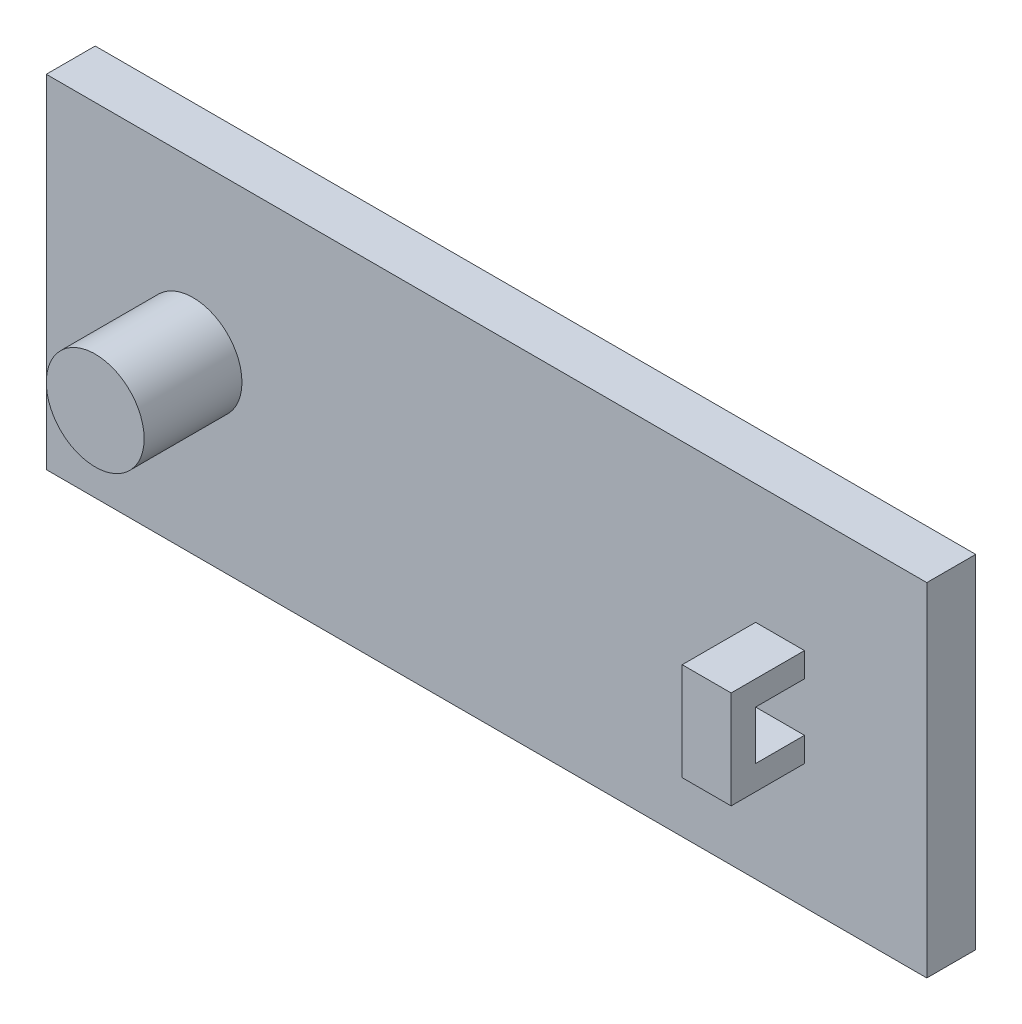
ISO-10303-21;
HEADER;
FILE_DESCRIPTION(('STEP AP214'),'2;1');
FILE_NAME('part.step','',(''),(''),'','','');
FILE_SCHEMA(('AUTOMOTIVE_DESIGN { 1 0 10303 214 1 1 1 1 }'));
ENDSEC;
DATA;
#1=APPLICATION_CONTEXT('core data for automotive mechanical design processes');
#2=APPLICATION_PROTOCOL_DEFINITION('international standard','automotive_design',2000,#1);
#3=PRODUCT_CONTEXT('',#1,'mechanical');
#4=PRODUCT('Part','Part','',(#3));
#5=PRODUCT_RELATED_PRODUCT_CATEGORY('part','',(#4));
#6=PRODUCT_DEFINITION_FORMATION('','',#4);
#7=PRODUCT_DEFINITION_CONTEXT('part definition',#1,'design');
#8=PRODUCT_DEFINITION('design','',#6,#7);
#9=PRODUCT_DEFINITION_SHAPE('','',#8);
#10=(LENGTH_UNIT() NAMED_UNIT(*) SI_UNIT(.MILLI.,.METRE.));
#11=(NAMED_UNIT(*) PLANE_ANGLE_UNIT() SI_UNIT($,.RADIAN.));
#12=(NAMED_UNIT(*) SI_UNIT($,.STERADIAN.) SOLID_ANGLE_UNIT());
#13=UNCERTAINTY_MEASURE_WITH_UNIT(LENGTH_MEASURE(1.E-05),#10,'distance_accuracy_value','');
#14=(GEOMETRIC_REPRESENTATION_CONTEXT(3) GLOBAL_UNCERTAINTY_ASSIGNED_CONTEXT((#13)) GLOBAL_UNIT_ASSIGNED_CONTEXT((#10,
#11,#12)) REPRESENTATION_CONTEXT('',''));
#15=CARTESIAN_POINT('',(0.,0.,0.));
#16=DIRECTION('',(0.,0.,1.));
#17=DIRECTION('',(1.,0.,0.));
#18=AXIS2_PLACEMENT_3D('',#15,#16,#17);
#19=CARTESIAN_POINT('',(0.,0.,1.));
#20=DIRECTION('',(0.,0.,1.));
#21=DIRECTION('',(1.,0.,0.));
#22=AXIS2_PLACEMENT_3D('',#19,#20,#21);
#23=PLANE('',#22);
#24=CARTESIAN_POINT('',(-11.5324267782427,1.96186854869997,1.));
#25=DIRECTION('',(0.,0.,1.));
#26=DIRECTION('',(1.,0.,0.));
#27=AXIS2_PLACEMENT_3D('',#24,#25,#26);
#28=CIRCLE('',#27,1.);
#29=CARTESIAN_POINT('',(-10.5324267782427,1.96186854869997,1.));
#30=VERTEX_POINT('',#29);
#31=EDGE_CURVE('E190',#30,#30,#28,.T.);
#32=ORIENTED_EDGE('',*,*,#31,.F.);
#33=EDGE_LOOP('',(#32));
#34=FACE_BOUND('',#33,.T.);
#35=DIRECTION('',(0.,1.,0.));
#36=VECTOR('',#35,1.);
#37=CARTESIAN_POINT('',(3.46757322175732,5.4152719665272,1.));
#38=LINE('',#37,#36);
#39=CARTESIAN_POINT('',(3.46757322175732,-1.5847280334728,1.));
#40=VERTEX_POINT('',#39);
#41=CARTESIAN_POINT('',(3.46757322175732,5.4152719665272,1.));
#42=VERTEX_POINT('',#41);
#43=EDGE_CURVE('E197',#40,#42,#38,.T.);
#44=ORIENTED_EDGE('',*,*,#43,.T.);
#45=DIRECTION('',(-1.,0.,0.));
#46=VECTOR('',#45,1.);
#47=CARTESIAN_POINT('',(-14.5324267782427,5.4152719665272,1.));
#48=LINE('',#47,#46);
#49=CARTESIAN_POINT('',(-14.5324267782427,5.4152719665272,1.));
#50=VERTEX_POINT('',#49);
#51=EDGE_CURVE('E200',#42,#50,#48,.T.);
#52=ORIENTED_EDGE('',*,*,#51,.T.);
#53=DIRECTION('',(0.,-1.,0.));
#54=VECTOR('',#53,1.);
#55=CARTESIAN_POINT('',(-14.5324267782427,5.4152719665272,1.));
#56=LINE('',#55,#54);
#57=CARTESIAN_POINT('',(-14.5324267782427,-1.5847280334728,1.));
#58=VERTEX_POINT('',#57);
#59=EDGE_CURVE('E203',#50,#58,#56,.T.);
#60=ORIENTED_EDGE('',*,*,#59,.T.);
#61=DIRECTION('',(1.,0.,0.));
#62=VECTOR('',#61,1.);
#63=CARTESIAN_POINT('',(-14.5324267782427,-1.5847280334728,1.));
#64=LINE('',#63,#62);
#65=EDGE_CURVE('E205',#58,#40,#64,.T.);
#66=ORIENTED_EDGE('',*,*,#65,.T.);
#67=EDGE_LOOP('',(#44,#52,#60,#66));
#68=FACE_BOUND('',#67,.T.);
#69=DIRECTION('',(-1.,0.,0.));
#70=VECTOR('',#69,1.);
#71=CARTESIAN_POINT('',(0.967573221757321,1.46186854869997,1.));
#72=LINE('',#71,#70);
#73=CARTESIAN_POINT('',(0.967573221757321,1.46186854869997,1.));
#74=VERTEX_POINT('',#73);
#75=CARTESIAN_POINT('',(-0.032426778242679,1.46186854869997,1.));
#76=VERTEX_POINT('',#75);
#77=EDGE_CURVE('E183',#74,#76,#72,.T.);
#78=ORIENTED_EDGE('',*,*,#77,.F.);
#79=DIRECTION('',(0.,1.,0.));
#80=VECTOR('',#79,1.);
#81=CARTESIAN_POINT('',(0.967573221757321,0.961868548699969,1.));
#82=LINE('',#81,#80);
#83=CARTESIAN_POINT('',(0.967573221757321,0.961868548699969,1.));
#84=VERTEX_POINT('',#83);
#85=EDGE_CURVE('E146',#84,#74,#82,.T.);
#86=ORIENTED_EDGE('',*,*,#85,.F.);
#87=DIRECTION('',(-1.,0.,0.));
#88=VECTOR('',#87,1.);
#89=CARTESIAN_POINT('',(0.967573221757321,0.961868548699969,1.));
#90=LINE('',#89,#88);
#91=CARTESIAN_POINT('',(-0.0324267782426789,0.961868548699969,1.));
#92=VERTEX_POINT('',#91);
#93=EDGE_CURVE('E186',#84,#92,#90,.T.);
#94=ORIENTED_EDGE('',*,*,#93,.T.);
#95=DIRECTION('',(0.,1.,0.));
#96=VECTOR('',#95,1.);
#97=CARTESIAN_POINT('',(-0.0324267782426789,0.961868548699969,1.));
#98=LINE('',#97,#96);
#99=EDGE_CURVE('E167',#92,#76,#98,.T.);
#100=ORIENTED_EDGE('',*,*,#99,.T.);
#101=EDGE_LOOP('',(#78,#86,#94,#100));
#102=FACE_BOUND('',#101,.T.);
#103=DIRECTION('',(-1.,0.,0.));
#104=VECTOR('',#103,1.);
#105=CARTESIAN_POINT('',(0.967573221757321,2.96186854869997,1.));
#106=LINE('',#105,#104);
#107=CARTESIAN_POINT('',(0.967573221757321,2.96186854869997,1.));
#108=VERTEX_POINT('',#107);
#109=CARTESIAN_POINT('',(-0.0324267782426791,2.96186854869997,1.));
#110=VERTEX_POINT('',#109);
#111=EDGE_CURVE('E52',#108,#110,#106,.T.);
#112=ORIENTED_EDGE('',*,*,#111,.F.);
#113=DIRECTION('',(0.,1.,0.));
#114=VECTOR('',#113,1.);
#115=CARTESIAN_POINT('',(0.967573221757321,2.46186854869997,1.));
#116=LINE('',#115,#114);
#117=CARTESIAN_POINT('',(0.967573221757321,2.46186854869997,1.));
#118=VERTEX_POINT('',#117);
#119=EDGE_CURVE('E57',#118,#108,#116,.T.);
#120=ORIENTED_EDGE('',*,*,#119,.F.);
#121=DIRECTION('',(-1.,0.,0.));
#122=VECTOR('',#121,1.);
#123=CARTESIAN_POINT('',(0.967573221757321,2.46186854869997,1.));
#124=LINE('',#123,#122);
#125=CARTESIAN_POINT('',(-0.0324267782426791,2.46186854869997,1.));
#126=VERTEX_POINT('',#125);
#127=EDGE_CURVE('E158',#118,#126,#124,.T.);
#128=ORIENTED_EDGE('',*,*,#127,.T.);
#129=DIRECTION('',(0.,1.,0.));
#130=VECTOR('',#129,1.);
#131=CARTESIAN_POINT('',(-0.0324267782426791,2.46186854869997,1.));
#132=LINE('',#131,#130);
#133=EDGE_CURVE('E159',#126,#110,#132,.T.);
#134=ORIENTED_EDGE('',*,*,#133,.T.);
#135=EDGE_LOOP('',(#112,#120,#128,#134));
#136=FACE_BOUND('',#135,.T.);
#137=ADVANCED_FACE('F37',(#34,#68,#102,#136),#23,.T.);
#138=CARTESIAN_POINT('',(3.46757322175732,5.4152719665272,1.));
#139=DIRECTION('',(-1.,0.,0.));
#140=DIRECTION('',(0.,-1.,0.));
#141=AXIS2_PLACEMENT_3D('',#138,#139,#140);
#142=PLANE('',#141);
#143=DIRECTION('',(0.,1.,0.));
#144=VECTOR('',#143,1.);
#145=CARTESIAN_POINT('',(3.46757322175732,5.4152719665272,0.));
#146=LINE('',#145,#144);
#147=CARTESIAN_POINT('',(3.46757322175732,-1.5847280334728,0.));
#148=VERTEX_POINT('',#147);
#149=CARTESIAN_POINT('',(3.46757322175732,5.4152719665272,0.));
#150=VERTEX_POINT('',#149);
#151=EDGE_CURVE('E194',#148,#150,#146,.T.);
#152=ORIENTED_EDGE('',*,*,#151,.T.);
#153=DIRECTION('',(0.,0.,-1.));
#154=VECTOR('',#153,1.);
#155=CARTESIAN_POINT('',(3.46757322175732,5.4152719665272,1.));
#156=LINE('',#155,#154);
#157=EDGE_CURVE('E11',#42,#150,#156,.T.);
#158=ORIENTED_EDGE('',*,*,#157,.F.);
#159=ORIENTED_EDGE('',*,*,#43,.F.);
#160=DIRECTION('',(0.,0.,-1.));
#161=VECTOR('',#160,1.);
#162=CARTESIAN_POINT('',(3.46757322175732,-1.5847280334728,1.));
#163=LINE('',#162,#161);
#164=EDGE_CURVE('E207',#40,#148,#163,.T.);
#165=ORIENTED_EDGE('',*,*,#164,.T.);
#166=EDGE_LOOP('',(#152,#158,#159,#165));
#167=FACE_BOUND('',#166,.T.);
#168=ADVANCED_FACE('F39',(#167),#142,.F.);
#169=CARTESIAN_POINT('',(-14.5324267782427,5.4152719665272,1.));
#170=DIRECTION('',(0.,-1.,0.));
#171=DIRECTION('',(0.,0.,-1.));
#172=AXIS2_PLACEMENT_3D('',#169,#170,#171);
#173=PLANE('',#172);
#174=DIRECTION('',(-1.,0.,0.));
#175=VECTOR('',#174,1.);
#176=CARTESIAN_POINT('',(-14.5324267782427,5.4152719665272,0.));
#177=LINE('',#176,#175);
#178=CARTESIAN_POINT('',(-14.5324267782427,5.4152719665272,0.));
#179=VERTEX_POINT('',#178);
#180=EDGE_CURVE('E210',#150,#179,#177,.T.);
#181=ORIENTED_EDGE('',*,*,#180,.T.);
#182=DIRECTION('',(0.,0.,-1.));
#183=VECTOR('',#182,1.);
#184=CARTESIAN_POINT('',(-14.5324267782427,5.4152719665272,1.));
#185=LINE('',#184,#183);
#186=EDGE_CURVE('E45',#50,#179,#185,.T.);
#187=ORIENTED_EDGE('',*,*,#186,.F.);
#188=ORIENTED_EDGE('',*,*,#51,.F.);
#189=ORIENTED_EDGE('',*,*,#157,.T.);
#190=EDGE_LOOP('',(#181,#187,#188,#189));
#191=FACE_BOUND('',#190,.T.);
#192=ADVANCED_FACE('F240',(#191),#173,.F.);
#193=CARTESIAN_POINT('',(-14.5324267782427,5.4152719665272,1.));
#194=DIRECTION('',(1.,0.,0.));
#195=DIRECTION('',(0.,0.,-1.));
#196=AXIS2_PLACEMENT_3D('',#193,#194,#195);
#197=PLANE('',#196);
#198=DIRECTION('',(0.,-1.,0.));
#199=VECTOR('',#198,1.);
#200=CARTESIAN_POINT('',(-14.5324267782427,5.4152719665272,0.));
#201=LINE('',#200,#199);
#202=CARTESIAN_POINT('',(-14.5324267782427,-1.5847280334728,0.));
#203=VERTEX_POINT('',#202);
#204=EDGE_CURVE('E212',#179,#203,#201,.T.);
#205=ORIENTED_EDGE('',*,*,#204,.T.);
#206=DIRECTION('',(0.,0.,-1.));
#207=VECTOR('',#206,1.);
#208=CARTESIAN_POINT('',(-14.5324267782427,-1.5847280334728,1.));
#209=LINE('',#208,#207);
#210=EDGE_CURVE('E217',#58,#203,#209,.T.);
#211=ORIENTED_EDGE('',*,*,#210,.F.);
#212=ORIENTED_EDGE('',*,*,#59,.F.);
#213=ORIENTED_EDGE('',*,*,#186,.T.);
#214=EDGE_LOOP('',(#205,#211,#212,#213));
#215=FACE_BOUND('',#214,.T.);
#216=ADVANCED_FACE('F224',(#215),#197,.F.);
#217=CARTESIAN_POINT('',(-14.5324267782427,-1.5847280334728,1.));
#218=DIRECTION('',(0.,1.,0.));
#219=DIRECTION('',(0.,0.,1.));
#220=AXIS2_PLACEMENT_3D('',#217,#218,#219);
#221=PLANE('',#220);
#222=DIRECTION('',(1.,0.,0.));
#223=VECTOR('',#222,1.);
#224=CARTESIAN_POINT('',(-14.5324267782427,-1.5847280334728,0.));
#225=LINE('',#224,#223);
#226=EDGE_CURVE('E201',#203,#148,#225,.T.);
#227=ORIENTED_EDGE('',*,*,#226,.T.);
#228=ORIENTED_EDGE('',*,*,#164,.F.);
#229=ORIENTED_EDGE('',*,*,#65,.F.);
#230=ORIENTED_EDGE('',*,*,#210,.T.);
#231=EDGE_LOOP('',(#227,#228,#229,#230));
#232=FACE_BOUND('',#231,.T.);
#233=ADVANCED_FACE('F233',(#232),#221,.F.);
#234=CARTESIAN_POINT('',(0.,0.,0.));
#235=DIRECTION('',(0.,0.,1.));
#236=DIRECTION('',(1.,0.,0.));
#237=AXIS2_PLACEMENT_3D('',#234,#235,#236);
#238=PLANE('',#237);
#239=ORIENTED_EDGE('',*,*,#151,.F.);
#240=ORIENTED_EDGE('',*,*,#226,.F.);
#241=ORIENTED_EDGE('',*,*,#204,.F.);
#242=ORIENTED_EDGE('',*,*,#180,.F.);
#243=EDGE_LOOP('',(#239,#240,#241,#242));
#244=FACE_BOUND('',#243,.T.);
#245=ADVANCED_FACE('F230',(#244),#238,.F.);
#246=CARTESIAN_POINT('',(-11.5324267782427,1.96186854869997,3.));
#247=DIRECTION('',(0.,0.,-1.));
#248=DIRECTION('',(-1.,0.,0.));
#249=AXIS2_PLACEMENT_3D('',#246,#247,#248);
#250=CYLINDRICAL_SURFACE('',#249,1.);
#251=CARTESIAN_POINT('',(-11.5324267782427,1.96186854869997,3.));
#252=DIRECTION('',(0.,0.,1.));
#253=DIRECTION('',(1.,0.,0.));
#254=AXIS2_PLACEMENT_3D('',#251,#252,#253);
#255=CIRCLE('',#254,1.);
#256=CARTESIAN_POINT('',(-10.5324267782427,1.96186854869997,3.));
#257=VERTEX_POINT('',#256);
#258=EDGE_CURVE('E191',#257,#257,#255,.T.);
#259=ORIENTED_EDGE('',*,*,#258,.F.);
#260=EDGE_LOOP('',(#259));
#261=FACE_BOUND('',#260,.T.);
#262=ORIENTED_EDGE('',*,*,#31,.T.);
#263=EDGE_LOOP('',(#262));
#264=FACE_BOUND('',#263,.T.);
#265=ADVANCED_FACE('F255',(#261,#264),#250,.T.);
#266=CARTESIAN_POINT('',(-11.5324267782427,1.96186854869997,3.));
#267=DIRECTION('',(0.,0.,1.));
#268=DIRECTION('',(1.,0.,0.));
#269=AXIS2_PLACEMENT_3D('',#266,#267,#268);
#270=PLANE('',#269);
#271=ORIENTED_EDGE('',*,*,#258,.T.);
#272=EDGE_LOOP('',(#271));
#273=FACE_BOUND('',#272,.T.);
#274=ADVANCED_FACE('F274',(#273),#270,.T.);
#275=CARTESIAN_POINT('',(0.967573221757321,2.96186854869997,2.5));
#276=DIRECTION('',(0.,-1.,0.));
#277=DIRECTION('',(1.,0.,0.));
#278=AXIS2_PLACEMENT_3D('',#275,#276,#277);
#279=PLANE('',#278);
#280=DIRECTION('',(0.,0.,1.));
#281=VECTOR('',#280,1.);
#282=CARTESIAN_POINT('',(-0.0324267782426791,2.96186854869997,2.5));
#283=LINE('',#282,#281);
#284=CARTESIAN_POINT('',(-0.0324267782426791,2.96186854869997,2.5));
#285=VERTEX_POINT('',#284);
#286=EDGE_CURVE('E136',#110,#285,#283,.T.);
#287=ORIENTED_EDGE('',*,*,#286,.T.);
#288=DIRECTION('',(-1.,0.,0.));
#289=VECTOR('',#288,1.);
#290=CARTESIAN_POINT('',(0.967573221757321,2.96186854869997,2.5));
#291=LINE('',#290,#289);
#292=CARTESIAN_POINT('',(0.967573221757321,2.96186854869997,2.5));
#293=VERTEX_POINT('',#292);
#294=EDGE_CURVE('E133',#293,#285,#291,.T.);
#295=ORIENTED_EDGE('',*,*,#294,.F.);
#296=DIRECTION('',(0.,0.,1.));
#297=VECTOR('',#296,1.);
#298=CARTESIAN_POINT('',(0.967573221757321,2.96186854869997,2.5));
#299=LINE('',#298,#297);
#300=EDGE_CURVE('E123',#108,#293,#299,.T.);
#301=ORIENTED_EDGE('',*,*,#300,.F.);
#302=ORIENTED_EDGE('',*,*,#111,.T.);
#303=EDGE_LOOP('',(#287,#295,#301,#302));
#304=FACE_BOUND('',#303,.T.);
#305=ADVANCED_FACE('F134',(#304),#279,.F.);
#306=CARTESIAN_POINT('',(0.967573221757321,0.961868548699968,2.5));
#307=DIRECTION('',(0.,0.,-1.));
#308=DIRECTION('',(-1.,0.,0.));
#309=AXIS2_PLACEMENT_3D('',#306,#307,#308);
#310=PLANE('',#309);
#311=DIRECTION('',(0.,-1.,0.));
#312=VECTOR('',#311,1.);
#313=CARTESIAN_POINT('',(-0.0324267782426789,0.961868548699968,2.5));
#314=LINE('',#313,#312);
#315=CARTESIAN_POINT('',(-0.0324267782426789,0.961868548699968,2.5));
#316=VERTEX_POINT('',#315);
#317=EDGE_CURVE('E162',#285,#316,#314,.T.);
#318=ORIENTED_EDGE('',*,*,#317,.T.);
#319=DIRECTION('',(-1.,0.,0.));
#320=VECTOR('',#319,1.);
#321=CARTESIAN_POINT('',(0.967573221757321,0.961868548699968,2.5));
#322=LINE('',#321,#320);
#323=CARTESIAN_POINT('',(0.967573221757321,0.961868548699968,2.5));
#324=VERTEX_POINT('',#323);
#325=EDGE_CURVE('E139',#324,#316,#322,.T.);
#326=ORIENTED_EDGE('',*,*,#325,.F.);
#327=DIRECTION('',(0.,-1.,0.));
#328=VECTOR('',#327,1.);
#329=CARTESIAN_POINT('',(0.967573221757321,0.961868548699968,2.5));
#330=LINE('',#329,#328);
#331=EDGE_CURVE('E128',#293,#324,#330,.T.);
#332=ORIENTED_EDGE('',*,*,#331,.F.);
#333=ORIENTED_EDGE('',*,*,#294,.T.);
#334=EDGE_LOOP('',(#318,#326,#332,#333));
#335=FACE_BOUND('',#334,.T.);
#336=ADVANCED_FACE('F141',(#335),#310,.F.);
#337=CARTESIAN_POINT('',(0.967573221757321,0.961868548699968,2.5));
#338=DIRECTION('',(0.,1.,0.));
#339=DIRECTION('',(0.,0.,1.));
#340=AXIS2_PLACEMENT_3D('',#337,#338,#339);
#341=PLANE('',#340);
#342=DIRECTION('',(0.,0.,-1.));
#343=VECTOR('',#342,1.);
#344=CARTESIAN_POINT('',(-0.0324267782426789,0.961868548699968,2.5));
#345=LINE('',#344,#343);
#346=EDGE_CURVE('E164',#316,#92,#345,.T.);
#347=ORIENTED_EDGE('',*,*,#346,.T.);
#348=ORIENTED_EDGE('',*,*,#93,.F.);
#349=DIRECTION('',(0.,0.,-1.));
#350=VECTOR('',#349,1.);
#351=CARTESIAN_POINT('',(0.967573221757321,0.961868548699968,2.5));
#352=LINE('',#351,#350);
#353=EDGE_CURVE('E144',#324,#84,#352,.T.);
#354=ORIENTED_EDGE('',*,*,#353,.F.);
#355=ORIENTED_EDGE('',*,*,#325,.T.);
#356=EDGE_LOOP('',(#347,#348,#354,#355));
#357=FACE_BOUND('',#356,.T.);
#358=ADVANCED_FACE('F293',(#357),#341,.F.);
#359=CARTESIAN_POINT('',(0.967573221757321,1.46186854869997,2.));
#360=DIRECTION('',(0.,-1.,0.));
#361=DIRECTION('',(1.,0.,0.));
#362=AXIS2_PLACEMENT_3D('',#359,#360,#361);
#363=PLANE('',#362);
#364=DIRECTION('',(0.,0.,1.));
#365=VECTOR('',#364,1.);
#366=CARTESIAN_POINT('',(-0.0324267782426789,1.46186854869997,2.));
#367=LINE('',#366,#365);
#368=CARTESIAN_POINT('',(-0.0324267782426789,1.46186854869997,2.));
#369=VERTEX_POINT('',#368);
#370=EDGE_CURVE('E169',#76,#369,#367,.T.);
#371=ORIENTED_EDGE('',*,*,#370,.T.);
#372=DIRECTION('',(-1.,0.,0.));
#373=VECTOR('',#372,1.);
#374=CARTESIAN_POINT('',(0.967573221757321,1.46186854869997,2.));
#375=LINE('',#374,#373);
#376=CARTESIAN_POINT('',(0.967573221757321,1.46186854869997,2.));
#377=VERTEX_POINT('',#376);
#378=EDGE_CURVE('E180',#377,#369,#375,.T.);
#379=ORIENTED_EDGE('',*,*,#378,.F.);
#380=DIRECTION('',(0.,0.,1.));
#381=VECTOR('',#380,1.);
#382=CARTESIAN_POINT('',(0.967573221757321,1.46186854869997,2.));
#383=LINE('',#382,#381);
#384=EDGE_CURVE('E152',#74,#377,#383,.T.);
#385=ORIENTED_EDGE('',*,*,#384,.F.);
#386=ORIENTED_EDGE('',*,*,#77,.T.);
#387=EDGE_LOOP('',(#371,#379,#385,#386));
#388=FACE_BOUND('',#387,.T.);
#389=ADVANCED_FACE('F300',(#388),#363,.F.);
#390=CARTESIAN_POINT('',(0.967573221757321,1.46186854869997,2.));
#391=DIRECTION('',(0.,0.,1.));
#392=DIRECTION('',(1.,0.,0.));
#393=AXIS2_PLACEMENT_3D('',#390,#391,#392);
#394=PLANE('',#393);
#395=DIRECTION('',(0.,1.,0.));
#396=VECTOR('',#395,1.);
#397=CARTESIAN_POINT('',(-0.0324267782426789,1.46186854869997,2.));
#398=LINE('',#397,#396);
#399=CARTESIAN_POINT('',(-0.0324267782426791,2.46186854869997,2.));
#400=VERTEX_POINT('',#399);
#401=EDGE_CURVE('E171',#369,#400,#398,.T.);
#402=ORIENTED_EDGE('',*,*,#401,.T.);
#403=DIRECTION('',(-1.,0.,0.));
#404=VECTOR('',#403,1.);
#405=CARTESIAN_POINT('',(0.967573221757321,2.46186854869997,2.));
#406=LINE('',#405,#404);
#407=CARTESIAN_POINT('',(0.967573221757321,2.46186854869997,2.));
#408=VERTEX_POINT('',#407);
#409=EDGE_CURVE('E177',#408,#400,#406,.T.);
#410=ORIENTED_EDGE('',*,*,#409,.F.);
#411=DIRECTION('',(0.,1.,0.));
#412=VECTOR('',#411,1.);
#413=CARTESIAN_POINT('',(0.967573221757321,1.46186854869997,2.));
#414=LINE('',#413,#412);
#415=EDGE_CURVE('E154',#377,#408,#414,.T.);
#416=ORIENTED_EDGE('',*,*,#415,.F.);
#417=ORIENTED_EDGE('',*,*,#378,.T.);
#418=EDGE_LOOP('',(#402,#410,#416,#417));
#419=FACE_BOUND('',#418,.T.);
#420=ADVANCED_FACE('F308',(#419),#394,.F.);
#421=CARTESIAN_POINT('',(0.967573221757321,2.46186854869997,2.));
#422=DIRECTION('',(0.,1.,0.));
#423=DIRECTION('',(0.,0.,1.));
#424=AXIS2_PLACEMENT_3D('',#421,#422,#423);
#425=PLANE('',#424);
#426=DIRECTION('',(0.,0.,-1.));
#427=VECTOR('',#426,1.);
#428=CARTESIAN_POINT('',(-0.0324267782426791,2.46186854869997,2.));
#429=LINE('',#428,#427);
#430=EDGE_CURVE('E173',#400,#126,#429,.T.);
#431=ORIENTED_EDGE('',*,*,#430,.T.);
#432=ORIENTED_EDGE('',*,*,#127,.F.);
#433=DIRECTION('',(0.,0.,-1.));
#434=VECTOR('',#433,1.);
#435=CARTESIAN_POINT('',(0.967573221757321,2.46186854869997,2.));
#436=LINE('',#435,#434);
#437=EDGE_CURVE('E156',#408,#118,#436,.T.);
#438=ORIENTED_EDGE('',*,*,#437,.F.);
#439=ORIENTED_EDGE('',*,*,#409,.T.);
#440=EDGE_LOOP('',(#431,#432,#438,#439));
#441=FACE_BOUND('',#440,.T.);
#442=ADVANCED_FACE('F316',(#441),#425,.F.);
#443=CARTESIAN_POINT('',(0.967573221757321,0.,0.));
#444=DIRECTION('',(-1.,0.,0.));
#445=DIRECTION('',(0.,-1.,0.));
#446=AXIS2_PLACEMENT_3D('',#443,#444,#445);
#447=PLANE('',#446);
#448=ORIENTED_EDGE('',*,*,#119,.T.);
#449=ORIENTED_EDGE('',*,*,#300,.T.);
#450=ORIENTED_EDGE('',*,*,#331,.T.);
#451=ORIENTED_EDGE('',*,*,#353,.T.);
#452=ORIENTED_EDGE('',*,*,#85,.T.);
#453=ORIENTED_EDGE('',*,*,#384,.T.);
#454=ORIENTED_EDGE('',*,*,#415,.T.);
#455=ORIENTED_EDGE('',*,*,#437,.T.);
#456=EDGE_LOOP('',(#448,#449,#450,#451,#452,#453,#454,#455));
#457=FACE_BOUND('',#456,.T.);
#458=ADVANCED_FACE('F125',(#457),#447,.F.);
#459=CARTESIAN_POINT('',(-0.0324267782426788,0.,0.));
#460=DIRECTION('',(-1.,0.,0.));
#461=DIRECTION('',(0.,-1.,0.));
#462=AXIS2_PLACEMENT_3D('',#459,#460,#461);
#463=PLANE('',#462);
#464=ORIENTED_EDGE('',*,*,#133,.F.);
#465=ORIENTED_EDGE('',*,*,#430,.F.);
#466=ORIENTED_EDGE('',*,*,#401,.F.);
#467=ORIENTED_EDGE('',*,*,#370,.F.);
#468=ORIENTED_EDGE('',*,*,#99,.F.);
#469=ORIENTED_EDGE('',*,*,#346,.F.);
#470=ORIENTED_EDGE('',*,*,#317,.F.);
#471=ORIENTED_EDGE('',*,*,#286,.F.);
#472=EDGE_LOOP('',(#464,#465,#466,#467,#468,#469,#470,#471));
#473=FACE_BOUND('',#472,.T.);
#474=ADVANCED_FACE('F331',(#473),#463,.T.);
#475=CLOSED_SHELL('',(#137,#168,#192,#216,#233,#245,#265,#274,#305,#336,#358,#389,#420,#442,
#458,#474));
#476=MANIFOLD_SOLID_BREP('B2',#475);
#477=ADVANCED_BREP_SHAPE_REPRESENTATION('',(#18,#476),#14);
#478=SHAPE_DEFINITION_REPRESENTATION(#9,#477);
ENDSEC;
END-ISO-10303-21;
